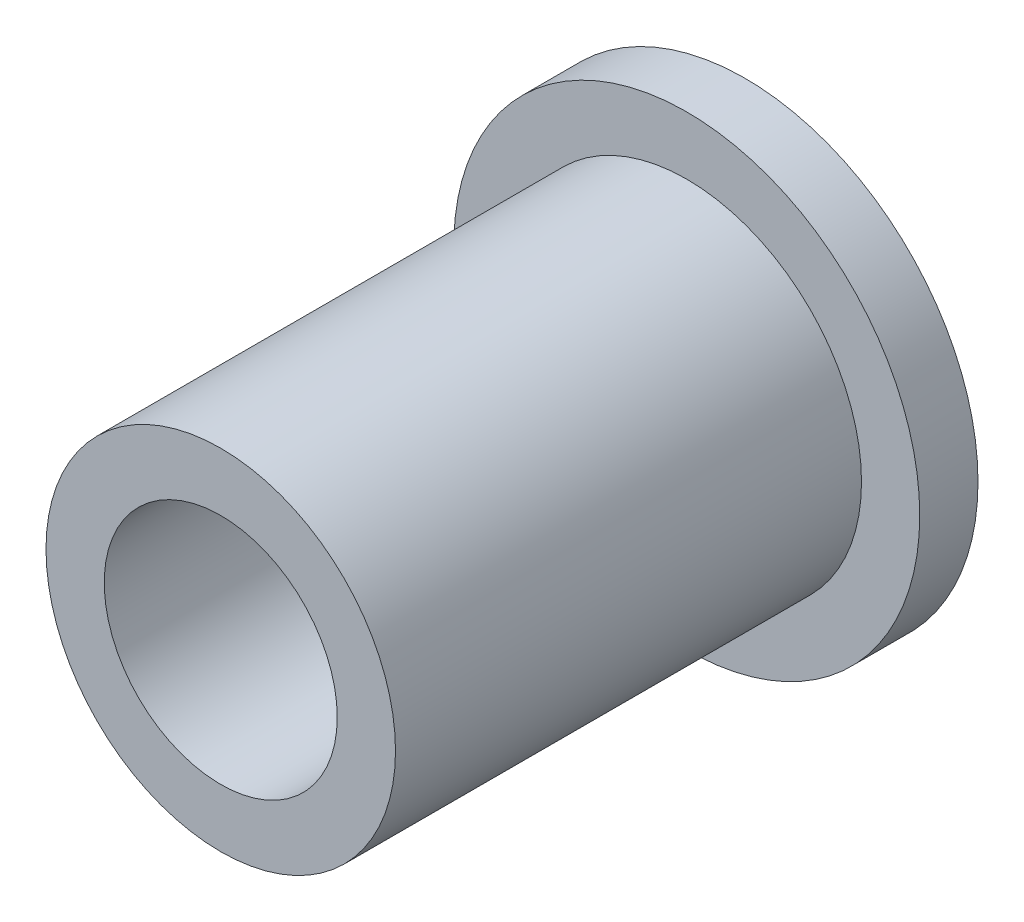
ISO-10303-21;
HEADER;
FILE_DESCRIPTION(('STEP AP214'),'2;1');
FILE_NAME('part.step','',(''),(''),'','','');
FILE_SCHEMA(('AUTOMOTIVE_DESIGN { 1 0 10303 214 1 1 1 1 }'));
ENDSEC;
DATA;
#1=APPLICATION_CONTEXT('core data for automotive mechanical design processes');
#2=APPLICATION_PROTOCOL_DEFINITION('international standard','automotive_design',2000,#1);
#3=PRODUCT_CONTEXT('',#1,'mechanical');
#4=PRODUCT('Part','Part','',(#3));
#5=PRODUCT_RELATED_PRODUCT_CATEGORY('part','',(#4));
#6=PRODUCT_DEFINITION_FORMATION('','',#4);
#7=PRODUCT_DEFINITION_CONTEXT('part definition',#1,'design');
#8=PRODUCT_DEFINITION('design','',#6,#7);
#9=PRODUCT_DEFINITION_SHAPE('','',#8);
#10=(LENGTH_UNIT() NAMED_UNIT(*) SI_UNIT(.MILLI.,.METRE.));
#11=(NAMED_UNIT(*) PLANE_ANGLE_UNIT() SI_UNIT($,.RADIAN.));
#12=(NAMED_UNIT(*) SI_UNIT($,.STERADIAN.) SOLID_ANGLE_UNIT());
#13=UNCERTAINTY_MEASURE_WITH_UNIT(LENGTH_MEASURE(1.E-05),#10,'distance_accuracy_value','');
#14=(GEOMETRIC_REPRESENTATION_CONTEXT(3) GLOBAL_UNCERTAINTY_ASSIGNED_CONTEXT((#13)) GLOBAL_UNIT_ASSIGNED_CONTEXT((#10,
#11,#12)) REPRESENTATION_CONTEXT('',''));
#15=CARTESIAN_POINT('',(0.,0.,0.));
#16=DIRECTION('',(0.,0.,1.));
#17=DIRECTION('',(1.,0.,0.));
#18=AXIS2_PLACEMENT_3D('',#15,#16,#17);
#19=CARTESIAN_POINT('',(0.,-14.1114213562373,0.));
#20=DIRECTION('',(0.,0.,1.));
#21=DIRECTION('',(1.,0.,0.));
#22=AXIS2_PLACEMENT_3D('',#19,#20,#21);
#23=PLANE('',#22);
#24=CARTESIAN_POINT('',(0.,0.,0.));
#25=DIRECTION('',(0.,0.,1.));
#26=DIRECTION('',(1.,0.,0.));
#27=AXIS2_PLACEMENT_3D('',#24,#25,#26);
#28=CIRCLE('',#27,6.35);
#29=CARTESIAN_POINT('',(6.35,0.,0.));
#30=VERTEX_POINT('',#29);
#31=EDGE_CURVE('E37',#30,#30,#28,.T.);
#32=ORIENTED_EDGE('',*,*,#31,.T.);
#33=EDGE_LOOP('',(#32));
#34=FACE_BOUND('',#33,.T.);
#35=CARTESIAN_POINT('',(0.,0.,0.));
#36=DIRECTION('',(0.,0.,1.));
#37=DIRECTION('',(1.,0.,0.));
#38=AXIS2_PLACEMENT_3D('',#35,#36,#37);
#39=CIRCLE('',#38,4.7625);
#40=CARTESIAN_POINT('',(4.7625,0.,0.));
#41=VERTEX_POINT('',#40);
#42=EDGE_CURVE('E47',#41,#41,#39,.T.);
#43=ORIENTED_EDGE('',*,*,#42,.F.);
#44=EDGE_LOOP('',(#43));
#45=FACE_BOUND('',#44,.T.);
#46=ADVANCED_FACE('F33',(#34,#45),#23,.T.);
#47=CARTESIAN_POINT('',(0.,0.,-1.5875));
#48=DIRECTION('',(0.,0.,1.));
#49=DIRECTION('',(1.,0.,0.));
#50=AXIS2_PLACEMENT_3D('',#47,#48,#49);
#51=CYLINDRICAL_SURFACE('',#50,6.35);
#52=CARTESIAN_POINT('',(0.,0.,-1.5875));
#53=DIRECTION('',(0.,0.,1.));
#54=DIRECTION('',(1.,0.,0.));
#55=AXIS2_PLACEMENT_3D('',#52,#53,#54);
#56=CIRCLE('',#55,6.35);
#57=CARTESIAN_POINT('',(6.35,0.,-1.5875));
#58=VERTEX_POINT('',#57);
#59=EDGE_CURVE('E41',#58,#58,#56,.T.);
#60=ORIENTED_EDGE('',*,*,#59,.T.);
#61=EDGE_LOOP('',(#60));
#62=FACE_BOUND('',#61,.T.);
#63=ORIENTED_EDGE('',*,*,#31,.F.);
#64=EDGE_LOOP('',(#63));
#65=FACE_BOUND('',#64,.T.);
#66=ADVANCED_FACE('F35',(#62,#65),#51,.T.);
#67=CARTESIAN_POINT('',(0.,0.,-1.5875));
#68=DIRECTION('',(0.,0.,1.));
#69=DIRECTION('',(1.,0.,0.));
#70=AXIS2_PLACEMENT_3D('',#67,#68,#69);
#71=CYLINDRICAL_SURFACE('',#70,3.175);
#72=CARTESIAN_POINT('',(0.,0.,-1.5875));
#73=DIRECTION('',(0.,0.,1.));
#74=DIRECTION('',(1.,0.,0.));
#75=AXIS2_PLACEMENT_3D('',#72,#73,#74);
#76=CIRCLE('',#75,3.175);
#77=CARTESIAN_POINT('',(3.175,0.,-1.5875));
#78=VERTEX_POINT('',#77);
#79=EDGE_CURVE('E10',#78,#78,#76,.T.);
#80=ORIENTED_EDGE('',*,*,#79,.F.);
#81=EDGE_LOOP('',(#80));
#82=FACE_BOUND('',#81,.T.);
#83=CARTESIAN_POINT('',(0.,0.,12.7));
#84=DIRECTION('',(0.,0.,1.));
#85=DIRECTION('',(1.,0.,0.));
#86=AXIS2_PLACEMENT_3D('',#83,#84,#85);
#87=CIRCLE('',#86,3.175);
#88=CARTESIAN_POINT('',(3.175,0.,12.7));
#89=VERTEX_POINT('',#88);
#90=EDGE_CURVE('E50',#89,#89,#87,.T.);
#91=ORIENTED_EDGE('',*,*,#90,.T.);
#92=EDGE_LOOP('',(#91));
#93=FACE_BOUND('',#92,.T.);
#94=ADVANCED_FACE('F57',(#82,#93),#71,.F.);
#95=CARTESIAN_POINT('',(0.,-14.1114213562373,-1.5875));
#96=DIRECTION('',(0.,0.,1.));
#97=DIRECTION('',(1.,0.,0.));
#98=AXIS2_PLACEMENT_3D('',#95,#96,#97);
#99=PLANE('',#98);
#100=ORIENTED_EDGE('',*,*,#59,.F.);
#101=EDGE_LOOP('',(#100));
#102=FACE_BOUND('',#101,.T.);
#103=ORIENTED_EDGE('',*,*,#79,.T.);
#104=EDGE_LOOP('',(#103));
#105=FACE_BOUND('',#104,.T.);
#106=ADVANCED_FACE('F68',(#102,#105),#99,.F.);
#107=CARTESIAN_POINT('',(0.,0.,12.7));
#108=DIRECTION('',(0.,0.,-1.));
#109=DIRECTION('',(-1.,0.,0.));
#110=AXIS2_PLACEMENT_3D('',#107,#108,#109);
#111=CYLINDRICAL_SURFACE('',#110,4.7625);
#112=CARTESIAN_POINT('',(0.,0.,12.7));
#113=DIRECTION('',(0.,0.,1.));
#114=DIRECTION('',(1.,0.,0.));
#115=AXIS2_PLACEMENT_3D('',#112,#113,#114);
#116=CIRCLE('',#115,4.7625);
#117=CARTESIAN_POINT('',(4.7625,0.,12.7));
#118=VERTEX_POINT('',#117);
#119=EDGE_CURVE('E51',#118,#118,#116,.T.);
#120=ORIENTED_EDGE('',*,*,#119,.F.);
#121=EDGE_LOOP('',(#120));
#122=FACE_BOUND('',#121,.T.);
#123=ORIENTED_EDGE('',*,*,#42,.T.);
#124=EDGE_LOOP('',(#123));
#125=FACE_BOUND('',#124,.T.);
#126=ADVANCED_FACE('F62',(#122,#125),#111,.T.);
#127=CARTESIAN_POINT('',(0.,-14.1114213562373,12.7));
#128=DIRECTION('',(0.,0.,1.));
#129=DIRECTION('',(1.,0.,0.));
#130=AXIS2_PLACEMENT_3D('',#127,#128,#129);
#131=PLANE('',#130);
#132=ORIENTED_EDGE('',*,*,#90,.F.);
#133=EDGE_LOOP('',(#132));
#134=FACE_BOUND('',#133,.T.);
#135=ORIENTED_EDGE('',*,*,#119,.T.);
#136=EDGE_LOOP('',(#135));
#137=FACE_BOUND('',#136,.T.);
#138=ADVANCED_FACE('F59',(#134,#137),#131,.T.);
#139=CLOSED_SHELL('',(#46,#66,#94,#106,#126,#138));
#140=MANIFOLD_SOLID_BREP('B2',#139);
#141=ADVANCED_BREP_SHAPE_REPRESENTATION('',(#18,#140),#14);
#142=SHAPE_DEFINITION_REPRESENTATION(#9,#141);
ENDSEC;
END-ISO-10303-21;
